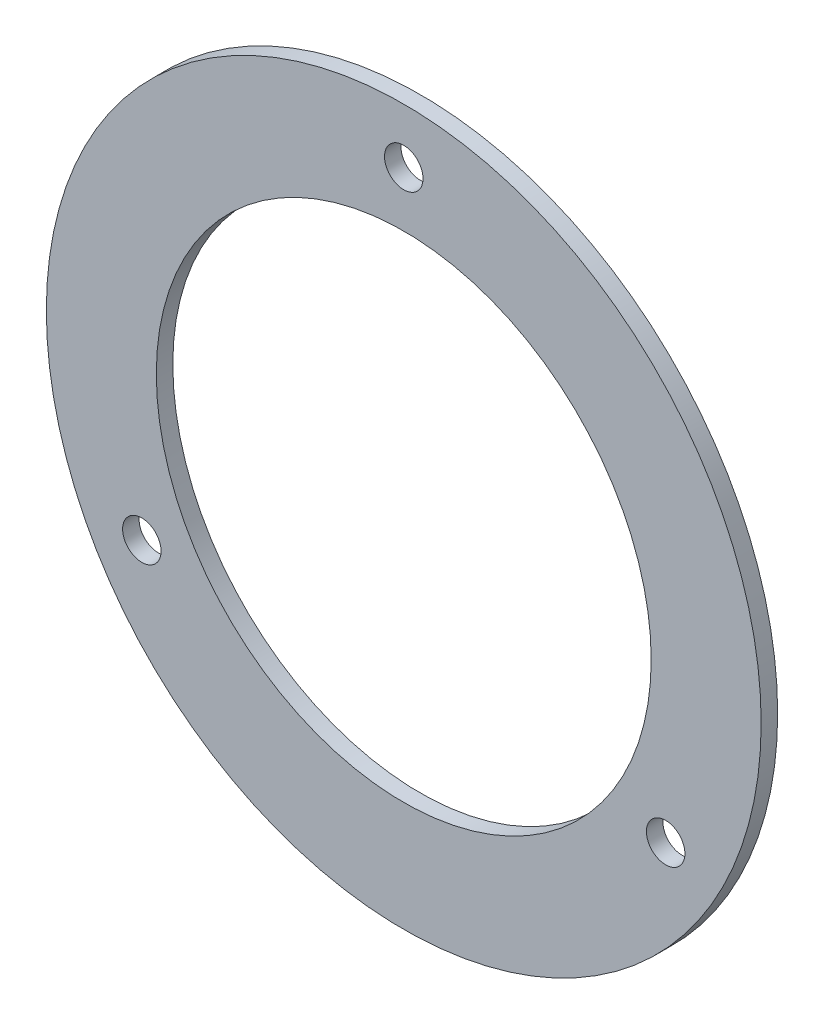
ISO-10303-21;
HEADER;
FILE_DESCRIPTION(('STEP AP214'),'2;1');
FILE_NAME('part.step','',(''),(''),'','','');
FILE_SCHEMA(('AUTOMOTIVE_DESIGN { 1 0 10303 214 1 1 1 1 }'));
ENDSEC;
DATA;
#1=APPLICATION_CONTEXT('core data for automotive mechanical design processes');
#2=APPLICATION_PROTOCOL_DEFINITION('international standard','automotive_design',2000,#1);
#3=PRODUCT_CONTEXT('',#1,'mechanical');
#4=PRODUCT('Part','Part','',(#3));
#5=PRODUCT_RELATED_PRODUCT_CATEGORY('part','',(#4));
#6=PRODUCT_DEFINITION_FORMATION('','',#4);
#7=PRODUCT_DEFINITION_CONTEXT('part definition',#1,'design');
#8=PRODUCT_DEFINITION('design','',#6,#7);
#9=PRODUCT_DEFINITION_SHAPE('','',#8);
#10=(LENGTH_UNIT() NAMED_UNIT(*) SI_UNIT(.MILLI.,.METRE.));
#11=(NAMED_UNIT(*) PLANE_ANGLE_UNIT() SI_UNIT($,.RADIAN.));
#12=(NAMED_UNIT(*) SI_UNIT($,.STERADIAN.) SOLID_ANGLE_UNIT());
#13=UNCERTAINTY_MEASURE_WITH_UNIT(LENGTH_MEASURE(1.E-05),#10,'distance_accuracy_value','');
#14=(GEOMETRIC_REPRESENTATION_CONTEXT(3) GLOBAL_UNCERTAINTY_ASSIGNED_CONTEXT((#13)) GLOBAL_UNIT_ASSIGNED_CONTEXT((#10,
#11,#12)) REPRESENTATION_CONTEXT('',''));
#15=CARTESIAN_POINT('',(0.,0.,0.));
#16=DIRECTION('',(0.,0.,1.));
#17=DIRECTION('',(1.,0.,0.));
#18=AXIS2_PLACEMENT_3D('',#15,#16,#17);
#19=CARTESIAN_POINT('',(0.,0.,3.));
#20=DIRECTION('',(0.,0.,1.));
#21=DIRECTION('',(1.,0.,0.));
#22=AXIS2_PLACEMENT_3D('',#19,#20,#21);
#23=PLANE('',#22);
#24=CARTESIAN_POINT('',(-47.631397208144,-27.5000000000002,3.));
#25=DIRECTION('',(0.,0.,1.));
#26=DIRECTION('',(-0.500000000000004,0.866025403784436,0.));
#27=AXIS2_PLACEMENT_3D('',#24,#25,#26);
#28=CIRCLE('',#27,3.5);
#29=CARTESIAN_POINT('',(-49.381397208144,-24.4689110867547,3.));
#30=VERTEX_POINT('',#29);
#31=EDGE_CURVE('E73',#30,#30,#28,.T.);
#32=ORIENTED_EDGE('',*,*,#31,.F.);
#33=EDGE_LOOP('',(#32));
#34=FACE_BOUND('',#33,.T.);
#35=CARTESIAN_POINT('',(47.6313972081444,-27.4999999999996,3.));
#36=DIRECTION('',(0.,0.,1.));
#37=DIRECTION('',(-0.499999999999992,-0.866025403784443,0.));
#38=AXIS2_PLACEMENT_3D('',#35,#36,#37);
#39=CIRCLE('',#38,3.5);
#40=CARTESIAN_POINT('',(45.8813972081444,-30.5310889132451,3.));
#41=VERTEX_POINT('',#40);
#42=EDGE_CURVE('E67',#41,#41,#39,.T.);
#43=ORIENTED_EDGE('',*,*,#42,.F.);
#44=EDGE_LOOP('',(#43));
#45=FACE_BOUND('',#44,.T.);
#46=CARTESIAN_POINT('',(0.,55.,3.));
#47=DIRECTION('',(0.,0.,1.));
#48=DIRECTION('',(1.,0.,0.));
#49=AXIS2_PLACEMENT_3D('',#46,#47,#48);
#50=CIRCLE('',#49,3.5);
#51=CARTESIAN_POINT('',(3.5,55.,3.));
#52=VERTEX_POINT('',#51);
#53=EDGE_CURVE('E61',#52,#52,#50,.T.);
#54=ORIENTED_EDGE('',*,*,#53,.F.);
#55=EDGE_LOOP('',(#54));
#56=FACE_BOUND('',#55,.T.);
#57=CARTESIAN_POINT('',(0.,0.,3.));
#58=DIRECTION('',(0.,0.,1.));
#59=DIRECTION('',(1.,0.,0.));
#60=AXIS2_PLACEMENT_3D('',#57,#58,#59);
#61=CIRCLE('',#60,65.);
#62=CARTESIAN_POINT('',(65.,0.,3.));
#63=VERTEX_POINT('',#62);
#64=EDGE_CURVE('E12',#63,#63,#61,.T.);
#65=ORIENTED_EDGE('',*,*,#64,.T.);
#66=EDGE_LOOP('',(#65));
#67=FACE_BOUND('',#66,.T.);
#68=CARTESIAN_POINT('',(0.,0.,3.));
#69=DIRECTION('',(0.,0.,1.));
#70=DIRECTION('',(1.,0.,0.));
#71=AXIS2_PLACEMENT_3D('',#68,#69,#70);
#72=CIRCLE('',#71,45.);
#73=CARTESIAN_POINT('',(45.,0.,3.));
#74=VERTEX_POINT('',#73);
#75=EDGE_CURVE('E53',#74,#74,#72,.T.);
#76=ORIENTED_EDGE('',*,*,#75,.F.);
#77=EDGE_LOOP('',(#76));
#78=FACE_BOUND('',#77,.T.);
#79=ADVANCED_FACE('F42',(#34,#45,#56,#67,#78),#23,.T.);
#80=CARTESIAN_POINT('',(0.,0.,0.));
#81=DIRECTION('',(0.,0.,1.));
#82=DIRECTION('',(1.,0.,0.));
#83=AXIS2_PLACEMENT_3D('',#80,#81,#82);
#84=PLANE('',#83);
#85=CARTESIAN_POINT('',(-47.631397208144,-27.5000000000002,0.));
#86=DIRECTION('',(0.,0.,1.));
#87=DIRECTION('',(-0.500000000000004,0.866025403784436,0.));
#88=AXIS2_PLACEMENT_3D('',#85,#86,#87);
#89=CIRCLE('',#88,3.5);
#90=CARTESIAN_POINT('',(-49.381397208144,-24.4689110867547,0.));
#91=VERTEX_POINT('',#90);
#92=EDGE_CURVE('E64',#91,#91,#89,.T.);
#93=ORIENTED_EDGE('',*,*,#92,.T.);
#94=EDGE_LOOP('',(#93));
#95=FACE_BOUND('',#94,.T.);
#96=CARTESIAN_POINT('',(47.6313972081444,-27.4999999999996,0.));
#97=DIRECTION('',(0.,0.,1.));
#98=DIRECTION('',(-0.499999999999992,-0.866025403784443,0.));
#99=AXIS2_PLACEMENT_3D('',#96,#97,#98);
#100=CIRCLE('',#99,3.5);
#101=CARTESIAN_POINT('',(45.8813972081444,-30.5310889132451,0.));
#102=VERTEX_POINT('',#101);
#103=EDGE_CURVE('E70',#102,#102,#100,.T.);
#104=ORIENTED_EDGE('',*,*,#103,.T.);
#105=EDGE_LOOP('',(#104));
#106=FACE_BOUND('',#105,.T.);
#107=CARTESIAN_POINT('',(0.,55.,0.));
#108=DIRECTION('',(0.,0.,1.));
#109=DIRECTION('',(1.,0.,0.));
#110=AXIS2_PLACEMENT_3D('',#107,#108,#109);
#111=CIRCLE('',#110,3.5);
#112=CARTESIAN_POINT('',(3.5,55.,0.));
#113=VERTEX_POINT('',#112);
#114=EDGE_CURVE('E58',#113,#113,#111,.T.);
#115=ORIENTED_EDGE('',*,*,#114,.T.);
#116=EDGE_LOOP('',(#115));
#117=FACE_BOUND('',#116,.T.);
#118=CARTESIAN_POINT('',(0.,0.,0.));
#119=DIRECTION('',(0.,0.,1.));
#120=DIRECTION('',(1.,0.,0.));
#121=AXIS2_PLACEMENT_3D('',#118,#119,#120);
#122=CIRCLE('',#121,65.);
#123=CARTESIAN_POINT('',(65.,0.,0.));
#124=VERTEX_POINT('',#123);
#125=EDGE_CURVE('E46',#124,#124,#122,.T.);
#126=ORIENTED_EDGE('',*,*,#125,.F.);
#127=EDGE_LOOP('',(#126));
#128=FACE_BOUND('',#127,.T.);
#129=CARTESIAN_POINT('',(0.,0.,0.));
#130=DIRECTION('',(0.,0.,1.));
#131=DIRECTION('',(1.,0.,0.));
#132=AXIS2_PLACEMENT_3D('',#129,#130,#131);
#133=CIRCLE('',#132,45.);
#134=CARTESIAN_POINT('',(45.,0.,0.));
#135=VERTEX_POINT('',#134);
#136=EDGE_CURVE('E55',#135,#135,#133,.T.);
#137=ORIENTED_EDGE('',*,*,#136,.T.);
#138=EDGE_LOOP('',(#137));
#139=FACE_BOUND('',#138,.T.);
#140=ADVANCED_FACE('F79',(#95,#106,#117,#128,#139),#84,.F.);
#141=CARTESIAN_POINT('',(0.,0.,3.));
#142=DIRECTION('',(0.,0.,-1.));
#143=DIRECTION('',(-1.,0.,0.));
#144=AXIS2_PLACEMENT_3D('',#141,#142,#143);
#145=CYLINDRICAL_SURFACE('',#144,65.);
#146=ORIENTED_EDGE('',*,*,#64,.F.);
#147=EDGE_LOOP('',(#146));
#148=FACE_BOUND('',#147,.T.);
#149=ORIENTED_EDGE('',*,*,#125,.T.);
#150=EDGE_LOOP('',(#149));
#151=FACE_BOUND('',#150,.T.);
#152=ADVANCED_FACE('F44',(#148,#151),#145,.T.);
#153=CARTESIAN_POINT('',(0.,0.,3.));
#154=DIRECTION('',(0.,0.,-1.));
#155=DIRECTION('',(-1.,0.,0.));
#156=AXIS2_PLACEMENT_3D('',#153,#154,#155);
#157=CYLINDRICAL_SURFACE('',#156,45.);
#158=ORIENTED_EDGE('',*,*,#75,.T.);
#159=EDGE_LOOP('',(#158));
#160=FACE_BOUND('',#159,.T.);
#161=ORIENTED_EDGE('',*,*,#136,.F.);
#162=EDGE_LOOP('',(#161));
#163=FACE_BOUND('',#162,.T.);
#164=ADVANCED_FACE('F98',(#160,#163),#157,.F.);
#165=CARTESIAN_POINT('',(0.,55.,0.));
#166=DIRECTION('',(0.,0.,1.));
#167=DIRECTION('',(1.,0.,0.));
#168=AXIS2_PLACEMENT_3D('',#165,#166,#167);
#169=CYLINDRICAL_SURFACE('',#168,3.5);
#170=ORIENTED_EDGE('',*,*,#114,.F.);
#171=EDGE_LOOP('',(#170));
#172=FACE_BOUND('',#171,.T.);
#173=ORIENTED_EDGE('',*,*,#53,.T.);
#174=EDGE_LOOP('',(#173));
#175=FACE_BOUND('',#174,.T.);
#176=ADVANCED_FACE('F101',(#172,#175),#169,.F.);
#177=CARTESIAN_POINT('',(47.6313972081444,-27.4999999999996,0.));
#178=DIRECTION('',(0.,0.,1.));
#179=DIRECTION('',(1.,0.,0.));
#180=AXIS2_PLACEMENT_3D('',#177,#178,#179);
#181=CYLINDRICAL_SURFACE('',#180,3.5);
#182=ORIENTED_EDGE('',*,*,#103,.F.);
#183=EDGE_LOOP('',(#182));
#184=FACE_BOUND('',#183,.T.);
#185=ORIENTED_EDGE('',*,*,#42,.T.);
#186=EDGE_LOOP('',(#185));
#187=FACE_BOUND('',#186,.T.);
#188=ADVANCED_FACE('F85',(#184,#187),#181,.F.);
#189=CARTESIAN_POINT('',(-47.631397208144,-27.5000000000002,0.));
#190=DIRECTION('',(0.,0.,1.));
#191=DIRECTION('',(1.,0.,0.));
#192=AXIS2_PLACEMENT_3D('',#189,#190,#191);
#193=CYLINDRICAL_SURFACE('',#192,3.5);
#194=ORIENTED_EDGE('',*,*,#92,.F.);
#195=EDGE_LOOP('',(#194));
#196=FACE_BOUND('',#195,.T.);
#197=ORIENTED_EDGE('',*,*,#31,.T.);
#198=EDGE_LOOP('',(#197));
#199=FACE_BOUND('',#198,.T.);
#200=ADVANCED_FACE('F82',(#196,#199),#193,.F.);
#201=CLOSED_SHELL('',(#79,#140,#152,#164,#176,#188,#200));
#202=MANIFOLD_SOLID_BREP('B2',#201);
#203=ADVANCED_BREP_SHAPE_REPRESENTATION('',(#18,#202),#14);
#204=SHAPE_DEFINITION_REPRESENTATION(#9,#203);
ENDSEC;
END-ISO-10303-21;
